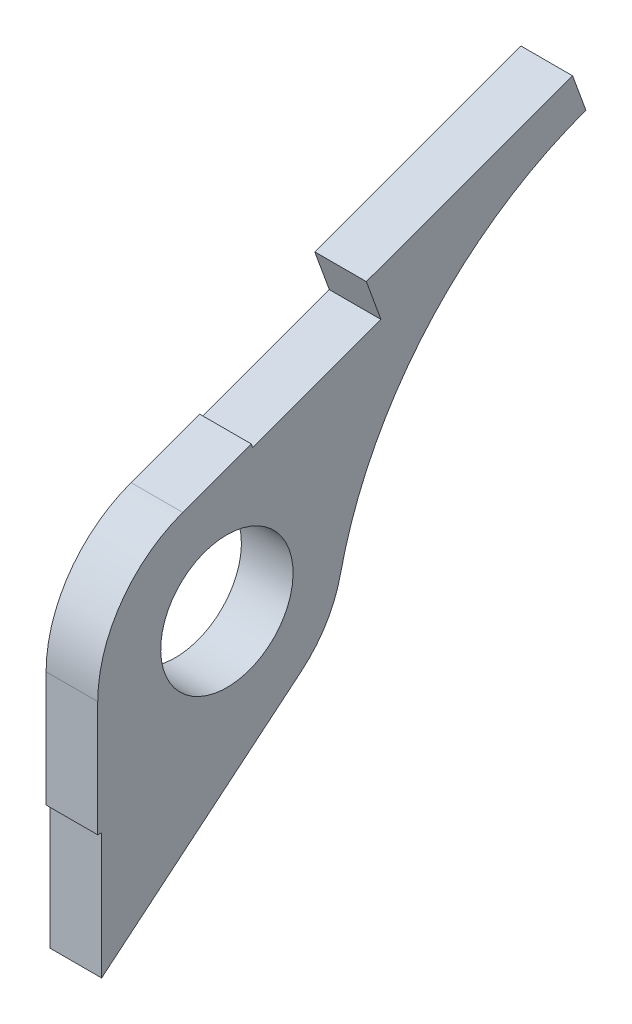
ISO-10303-21;
HEADER;
FILE_DESCRIPTION(('STEP AP214'),'2;1');
FILE_NAME('part.step','',(''),(''),'','','');
FILE_SCHEMA(('AUTOMOTIVE_DESIGN { 1 0 10303 214 1 1 1 1 }'));
ENDSEC;
DATA;
#1=APPLICATION_CONTEXT('core data for automotive mechanical design processes');
#2=APPLICATION_PROTOCOL_DEFINITION('international standard','automotive_design',2000,#1);
#3=PRODUCT_CONTEXT('',#1,'mechanical');
#4=PRODUCT('Part','Part','',(#3));
#5=PRODUCT_RELATED_PRODUCT_CATEGORY('part','',(#4));
#6=PRODUCT_DEFINITION_FORMATION('','',#4);
#7=PRODUCT_DEFINITION_CONTEXT('part definition',#1,'design');
#8=PRODUCT_DEFINITION('design','',#6,#7);
#9=PRODUCT_DEFINITION_SHAPE('','',#8);
#10=(LENGTH_UNIT() NAMED_UNIT(*) SI_UNIT(.MILLI.,.METRE.));
#11=(NAMED_UNIT(*) PLANE_ANGLE_UNIT() SI_UNIT($,.RADIAN.));
#12=(NAMED_UNIT(*) SI_UNIT($,.STERADIAN.) SOLID_ANGLE_UNIT());
#13=UNCERTAINTY_MEASURE_WITH_UNIT(LENGTH_MEASURE(1.E-05),#10,'distance_accuracy_value','');
#14=(GEOMETRIC_REPRESENTATION_CONTEXT(3) GLOBAL_UNCERTAINTY_ASSIGNED_CONTEXT((#13)) GLOBAL_UNIT_ASSIGNED_CONTEXT((#10,
#11,#12)) REPRESENTATION_CONTEXT('',''));
#15=CARTESIAN_POINT('',(0.,0.,0.));
#16=DIRECTION('',(0.,0.,1.));
#17=DIRECTION('',(1.,0.,0.));
#18=AXIS2_PLACEMENT_3D('',#15,#16,#17);
#19=CARTESIAN_POINT('',(195.308851424871,106.448198171886,262.091802222187));
#20=DIRECTION('',(0.,0.342020143325663,-0.93969262078591));
#21=DIRECTION('',(0.,0.939692620785911,0.342020143325663));
#22=AXIS2_PLACEMENT_3D('',#19,#20,#21);
#23=PLANE('',#22);
#24=DIRECTION('',(0.,0.93969262078591,0.342020143325663));
#25=VECTOR('',#24,1.);
#26=CARTESIAN_POINT('',(191.308851424871,106.448198171886,262.091802222187));
#27=LINE('',#26,#25);
#28=CARTESIAN_POINT('',(191.308851424871,106.730105958122,262.194408265185));
#29=VERTEX_POINT('',#28);
#30=CARTESIAN_POINT('',(191.308851424871,109.549183820479,263.220468695162));
#31=VERTEX_POINT('',#30);
#32=EDGE_CURVE('E162',#29,#31,#27,.T.);
#33=ORIENTED_EDGE('',*,*,#32,.T.);
#34=DIRECTION('',(-1.,0.,0.));
#35=VECTOR('',#34,1.);
#36=CARTESIAN_POINT('',(195.308851424871,109.549183820479,263.220468695162));
#37=LINE('',#36,#35);
#38=CARTESIAN_POINT('',(195.308851424871,109.549183820479,263.220468695162));
#39=VERTEX_POINT('',#38);
#40=EDGE_CURVE('E54',#39,#31,#37,.T.);
#41=ORIENTED_EDGE('',*,*,#40,.F.);
#42=DIRECTION('',(0.,0.93969262078591,0.342020143325663));
#43=VECTOR('',#42,1.);
#44=CARTESIAN_POINT('',(195.308851424871,106.448198171886,262.091802222187));
#45=LINE('',#44,#43);
#46=CARTESIAN_POINT('',(195.308851424871,106.730105958122,262.194408265185));
#47=VERTEX_POINT('',#46);
#48=EDGE_CURVE('E182',#47,#39,#45,.T.);
#49=ORIENTED_EDGE('',*,*,#48,.F.);
#50=DIRECTION('',(1.,0.,0.));
#51=VECTOR('',#50,1.);
#52=CARTESIAN_POINT('',(191.308851424871,106.730105958122,262.194408265185));
#53=LINE('',#52,#51);
#54=EDGE_CURVE('E195',#29,#47,#53,.T.);
#55=ORIENTED_EDGE('',*,*,#54,.F.);
#56=EDGE_LOOP('',(#33,#41,#49,#55));
#57=FACE_BOUND('',#56,.T.);
#58=ADVANCED_FACE('F37',(#57),#23,.T.);
#59=CARTESIAN_POINT('',(195.308851424871,100.63385573535,278.066576775547));
#60=DIRECTION('',(0.,-0.342020143325663,0.93969262078591));
#61=DIRECTION('',(0.,-0.939692620785911,-0.342020143325663));
#62=AXIS2_PLACEMENT_3D('',#59,#60,#61);
#63=PLANE('',#62);
#64=DIRECTION('',(0.,0.93969262078591,0.342020143325663));
#65=VECTOR('',#64,1.);
#66=CARTESIAN_POINT('',(195.308851424871,100.63385573535,278.066576775547));
#67=LINE('',#66,#65);
#68=CARTESIAN_POINT('',(195.308851424871,100.63385573535,278.066576775547));
#69=VERTEX_POINT('',#68);
#70=CARTESIAN_POINT('',(195.308851424871,103.734841383943,279.195243248522));
#71=VERTEX_POINT('',#70);
#72=EDGE_CURVE('E148',#69,#71,#67,.T.);
#73=ORIENTED_EDGE('',*,*,#72,.T.);
#74=DIRECTION('',(1.,0.,0.));
#75=VECTOR('',#74,1.);
#76=CARTESIAN_POINT('',(191.308851424871,103.734841383943,279.195243248522));
#77=LINE('',#76,#75);
#78=CARTESIAN_POINT('',(191.308851424871,103.734841383943,279.195243248522));
#79=VERTEX_POINT('',#78);
#80=EDGE_CURVE('E134',#79,#71,#77,.T.);
#81=ORIENTED_EDGE('',*,*,#80,.F.);
#82=DIRECTION('',(0.,0.93969262078591,0.342020143325663));
#83=VECTOR('',#82,1.);
#84=CARTESIAN_POINT('',(191.308851424871,100.63385573535,278.066576775547));
#85=LINE('',#84,#83);
#86=CARTESIAN_POINT('',(191.308851424871,100.63385573535,278.066576775547));
#87=VERTEX_POINT('',#86);
#88=EDGE_CURVE('E146',#87,#79,#85,.T.);
#89=ORIENTED_EDGE('',*,*,#88,.F.);
#90=DIRECTION('',(1.,0.,0.));
#91=VECTOR('',#90,1.);
#92=CARTESIAN_POINT('',(195.308851424871,100.63385573535,278.066576775547));
#93=LINE('',#92,#91);
#94=EDGE_CURVE('E166',#87,#69,#93,.T.);
#95=ORIENTED_EDGE('',*,*,#94,.T.);
#96=EDGE_LOOP('',(#73,#81,#89,#95));
#97=FACE_BOUND('',#96,.T.);
#98=ADVANCED_FACE('F144',(#97),#63,.T.);
#99=CARTESIAN_POINT('',(195.308851424871,78.5393273345444,251.933803965415));
#100=DIRECTION('',(-1.,0.,0.));
#101=DIRECTION('',(0.,-1.,0.));
#102=AXIS2_PLACEMENT_3D('',#99,#100,#101);
#103=PLANE('',#102);
#104=CARTESIAN_POINT('',(195.308851424871,87.0329435138107,289.997677706789));
#105=DIRECTION('',(1.,0.,0.));
#106=DIRECTION('',(0.,1.,0.));
#107=AXIS2_PLACEMENT_3D('',#104,#105,#106);
#108=CIRCLE('',#107,5.125);
#109=CARTESIAN_POINT('',(195.308851424871,92.1579435138107,289.997677706789));
#110=VERTEX_POINT('',#109);
#111=EDGE_CURVE('E168',#110,#110,#108,.T.);
#112=ORIENTED_EDGE('',*,*,#111,.F.);
#113=EDGE_LOOP('',(#112));
#114=FACE_BOUND('',#113,.T.);
#115=DIRECTION('',(0.,0.342020143325663,-0.93969262078591));
#116=VECTOR('',#115,1.);
#117=CARTESIAN_POINT('',(195.308851424871,103.734841383943,279.195243248522));
#118=LINE('',#117,#116);
#119=EDGE_CURVE('E149',#71,#39,#118,.T.);
#120=ORIENTED_EDGE('',*,*,#119,.F.);
#121=ORIENTED_EDGE('',*,*,#72,.F.);
#122=DIRECTION('',(0.,0.342020143325663,-0.939692620785911));
#123=VECTOR('',#122,1.);
#124=CARTESIAN_POINT('',(195.308851424871,106.448198171886,262.091802222187));
#125=LINE('',#124,#123);
#126=CARTESIAN_POINT('',(195.308851424871,97.0186352651759,287.9993133837));
#127=VERTEX_POINT('',#126);
#128=EDGE_CURVE('E165',#127,#69,#125,.T.);
#129=ORIENTED_EDGE('',*,*,#128,.F.);
#130=DIRECTION('',(0.,-0.939692620785911,-0.342020143325663));
#131=VECTOR('',#130,1.);
#132=CARTESIAN_POINT('',(195.308851424871,69.1097644278345,277.841315126928));
#133=LINE('',#132,#131);
#134=CARTESIAN_POINT('',(195.308851424871,97.3005430514117,288.101919426697));
#135=VERTEX_POINT('',#134);
#136=EDGE_CURVE('E46',#135,#127,#133,.T.);
#137=ORIENTED_EDGE('',*,*,#136,.F.);
#138=DIRECTION('',(0.,-0.342020143325663,0.93969262078591));
#139=VECTOR('',#138,1.);
#140=CARTESIAN_POINT('',(195.308851424871,95.3656919491948,293.417879140046));
#141=LINE('',#140,#139);
#142=CARTESIAN_POINT('',(195.308851424871,95.3656919491944,293.417879140046));
#143=VERTEX_POINT('',#142);
#144=EDGE_CURVE('E41',#135,#143,#141,.T.);
#145=ORIENTED_EDGE('',*,*,#144,.T.);
#146=CARTESIAN_POINT('',(195.308851424871,85.9687657413348,289.997677706789));
#147=DIRECTION('',(1.,0.,0.));
#148=DIRECTION('',(0.,1.,0.));
#149=AXIS2_PLACEMENT_3D('',#146,#147,#148);
#150=CIRCLE('',#149,10.0000000000004);
#151=CARTESIAN_POINT('',(195.308851424871,85.9687657413357,299.997677706789));
#152=VERTEX_POINT('',#151);
#153=EDGE_CURVE('E218',#143,#152,#150,.T.);
#154=ORIENTED_EDGE('',*,*,#153,.T.);
#155=DIRECTION('',(0.,-1.,0.));
#156=VECTOR('',#155,1.);
#157=CARTESIAN_POINT('',(195.308851424871,67.0329435138107,299.997677706789));
#158=LINE('',#157,#156);
#159=CARTESIAN_POINT('',(195.308851424871,77.0329435138107,299.997677706789));
#160=VERTEX_POINT('',#159);
#161=EDGE_CURVE('E215',#152,#160,#158,.T.);
#162=ORIENTED_EDGE('',*,*,#161,.T.);
#163=DIRECTION('',(0.,0.,-1.));
#164=VECTOR('',#163,1.);
#165=CARTESIAN_POINT('',(195.308851424871,77.0329435138107,251.933803965415));
#166=LINE('',#165,#164);
#167=CARTESIAN_POINT('',(195.308851424871,77.0329435138107,299.697677706789));
#168=VERTEX_POINT('',#167);
#169=EDGE_CURVE('E214',#160,#168,#166,.T.);
#170=ORIENTED_EDGE('',*,*,#169,.T.);
#171=DIRECTION('',(0.,1.,0.));
#172=VECTOR('',#171,1.);
#173=CARTESIAN_POINT('',(195.308851424871,78.5393273345444,299.697677706789));
#174=LINE('',#173,#172);
#175=CARTESIAN_POINT('',(195.308851424871,67.2820160599038,299.697677706789));
#176=VERTEX_POINT('',#175);
#177=EDGE_CURVE('E176',#176,#168,#174,.T.);
#178=ORIENTED_EDGE('',*,*,#177,.F.);
#179=DIRECTION('',(0.,0.638779579618374,-0.769389789809154));
#180=VECTOR('',#179,1.);
#181=CARTESIAN_POINT('',(195.308851424871,67.0329435138107,299.997677706789));
#182=LINE('',#181,#180);
#183=CARTESIAN_POINT('',(195.308851424871,80.1084354055289,284.248661490224));
#184=VERTEX_POINT('',#183);
#185=EDGE_CURVE('E212',#176,#184,#182,.T.);
#186=ORIENTED_EDGE('',*,*,#185,.T.);
#187=CARTESIAN_POINT('',(195.308851424871,87.0329435138107,289.997677706789));
#188=DIRECTION('',(1.,0.,0.));
#189=DIRECTION('',(0.,-1.,0.));
#190=AXIS2_PLACEMENT_3D('',#187,#188,#189);
#191=CIRCLE('',#190,8.99999999999954);
#192=CARTESIAN_POINT('',(195.308851424871,85.0728782416731,281.213706843395));
#193=VERTEX_POINT('',#192);
#194=EDGE_CURVE('E192',#184,#193,#191,.T.);
#195=ORIENTED_EDGE('',*,*,#194,.T.);
#196=CARTESIAN_POINT('',(195.308851424871,78.5393273345444,251.933803965415));
#197=DIRECTION('',(-1.,0.,0.));
#198=DIRECTION('',(0.,-1.,0.));
#199=AXIS2_PLACEMENT_3D('',#196,#197,#198);
#200=CIRCLE('',#199,30.);
#201=EDGE_CURVE('E189',#193,#47,#200,.T.);
#202=ORIENTED_EDGE('',*,*,#201,.T.);
#203=ORIENTED_EDGE('',*,*,#48,.T.);
#204=EDGE_LOOP('',(#120,#121,#129,#137,#145,#154,#162,#170,#178,#186,#195,#202,#203));
#205=FACE_BOUND('',#204,.T.);
#206=ADVANCED_FACE('F276',(#114,#205),#103,.F.);
#207=CARTESIAN_POINT('',(191.308851424871,78.5393273345444,251.933803965415));
#208=DIRECTION('',(-1.,0.,0.));
#209=DIRECTION('',(0.,-1.,0.));
#210=AXIS2_PLACEMENT_3D('',#207,#208,#209);
#211=PLANE('',#210);
#212=CARTESIAN_POINT('',(191.308851424871,87.0329435138107,289.997677706789));
#213=DIRECTION('',(1.,0.,0.));
#214=DIRECTION('',(0.,1.,0.));
#215=AXIS2_PLACEMENT_3D('',#212,#213,#214);
#216=CIRCLE('',#215,5.125);
#217=CARTESIAN_POINT('',(191.308851424871,92.1579435138107,289.997677706789));
#218=VERTEX_POINT('',#217);
#219=EDGE_CURVE('E170',#218,#218,#216,.T.);
#220=ORIENTED_EDGE('',*,*,#219,.T.);
#221=EDGE_LOOP('',(#220));
#222=FACE_BOUND('',#221,.T.);
#223=ORIENTED_EDGE('',*,*,#88,.T.);
#224=DIRECTION('',(0.,-0.342020143325663,0.939692620785911));
#225=VECTOR('',#224,1.);
#226=CARTESIAN_POINT('',(191.308851424871,109.549183820479,263.220468695162));
#227=LINE('',#226,#225);
#228=EDGE_CURVE('E131',#31,#79,#227,.T.);
#229=ORIENTED_EDGE('',*,*,#228,.F.);
#230=ORIENTED_EDGE('',*,*,#32,.F.);
#231=CARTESIAN_POINT('',(191.308851424871,78.5393273345444,251.933803965415));
#232=DIRECTION('',(-1.,0.,0.));
#233=DIRECTION('',(0.,-1.,0.));
#234=AXIS2_PLACEMENT_3D('',#231,#232,#233);
#235=CIRCLE('',#234,30.);
#236=CARTESIAN_POINT('',(191.308851424871,85.0728782416731,281.213706843395));
#237=VERTEX_POINT('',#236);
#238=EDGE_CURVE('E198',#237,#29,#235,.T.);
#239=ORIENTED_EDGE('',*,*,#238,.F.);
#240=CARTESIAN_POINT('',(191.308851424871,87.0329435138107,289.997677706789));
#241=DIRECTION('',(1.,0.,0.));
#242=DIRECTION('',(0.,-1.,0.));
#243=AXIS2_PLACEMENT_3D('',#240,#241,#242);
#244=CIRCLE('',#243,8.99999999999954);
#245=CARTESIAN_POINT('',(191.308851424871,80.1084354055289,284.248661490224));
#246=VERTEX_POINT('',#245);
#247=EDGE_CURVE('E197',#246,#237,#244,.T.);
#248=ORIENTED_EDGE('',*,*,#247,.F.);
#249=DIRECTION('',(0.,0.638779579618374,-0.769389789809154));
#250=VECTOR('',#249,1.);
#251=CARTESIAN_POINT('',(191.308851424871,67.0329435138107,299.997677706789));
#252=LINE('',#251,#250);
#253=CARTESIAN_POINT('',(191.308851424871,67.2820160599038,299.697677706789));
#254=VERTEX_POINT('',#253);
#255=EDGE_CURVE('E206',#254,#246,#252,.T.);
#256=ORIENTED_EDGE('',*,*,#255,.F.);
#257=DIRECTION('',(0.,-1.,0.));
#258=VECTOR('',#257,1.);
#259=CARTESIAN_POINT('',(191.308851424871,77.0329435138107,299.697677706789));
#260=LINE('',#259,#258);
#261=CARTESIAN_POINT('',(191.308851424871,77.0329435138107,299.697677706789));
#262=VERTEX_POINT('',#261);
#263=EDGE_CURVE('E175',#262,#254,#260,.T.);
#264=ORIENTED_EDGE('',*,*,#263,.F.);
#265=DIRECTION('',(0.,0.,1.));
#266=VECTOR('',#265,1.);
#267=CARTESIAN_POINT('',(191.308851424871,77.0329435138107,299.697677706789));
#268=LINE('',#267,#266);
#269=CARTESIAN_POINT('',(191.308851424871,77.0329435138107,299.997677706789));
#270=VERTEX_POINT('',#269);
#271=EDGE_CURVE('E154',#262,#270,#268,.T.);
#272=ORIENTED_EDGE('',*,*,#271,.T.);
#273=DIRECTION('',(0.,-1.,0.));
#274=VECTOR('',#273,1.);
#275=CARTESIAN_POINT('',(191.308851424871,67.0329435138107,299.997677706789));
#276=LINE('',#275,#274);
#277=CARTESIAN_POINT('',(191.308851424871,85.9687657413357,299.997677706789));
#278=VERTEX_POINT('',#277);
#279=EDGE_CURVE('E179',#278,#270,#276,.T.);
#280=ORIENTED_EDGE('',*,*,#279,.F.);
#281=CARTESIAN_POINT('',(191.308851424871,85.9687657413349,289.997677706789));
#282=DIRECTION('',(1.,0.,0.));
#283=DIRECTION('',(0.,1.,0.));
#284=AXIS2_PLACEMENT_3D('',#281,#282,#283);
#285=CIRCLE('',#284,10.0000000000004);
#286=CARTESIAN_POINT('',(191.308851424871,95.3656919491944,293.417879140046));
#287=VERTEX_POINT('',#286);
#288=EDGE_CURVE('E202',#287,#278,#285,.T.);
#289=ORIENTED_EDGE('',*,*,#288,.F.);
#290=DIRECTION('',(0.,-0.342020143325663,0.93969262078591));
#291=VECTOR('',#290,1.);
#292=CARTESIAN_POINT('',(191.308851424871,95.3656919491948,293.417879140046));
#293=LINE('',#292,#291);
#294=CARTESIAN_POINT('',(191.308851424871,97.3005430514117,288.101919426697));
#295=VERTEX_POINT('',#294);
#296=EDGE_CURVE('E180',#295,#287,#293,.T.);
#297=ORIENTED_EDGE('',*,*,#296,.F.);
#298=DIRECTION('',(0.,-0.939692620785911,-0.342020143325663));
#299=VECTOR('',#298,1.);
#300=CARTESIAN_POINT('',(191.308851424871,69.1097644278345,277.841315126928));
#301=LINE('',#300,#299);
#302=CARTESIAN_POINT('',(191.308851424871,97.0186352651759,287.9993133837));
#303=VERTEX_POINT('',#302);
#304=EDGE_CURVE('E61',#295,#303,#301,.T.);
#305=ORIENTED_EDGE('',*,*,#304,.T.);
#306=DIRECTION('',(0.,0.342020143325663,-0.939692620785911));
#307=VECTOR('',#306,1.);
#308=CARTESIAN_POINT('',(191.308851424871,106.448198171886,262.091802222187));
#309=LINE('',#308,#307);
#310=EDGE_CURVE('E153',#303,#87,#309,.T.);
#311=ORIENTED_EDGE('',*,*,#310,.T.);
#312=EDGE_LOOP('',(#223,#229,#230,#239,#248,#256,#264,#272,#280,#289,#297,#305,#311));
#313=FACE_BOUND('',#312,.T.);
#314=ADVANCED_FACE('F152',(#222,#313),#211,.T.);
#315=CARTESIAN_POINT('',(191.308851424871,78.5393273345444,251.933803965415));
#316=DIRECTION('',(1.,0.,0.));
#317=DIRECTION('',(0.,1.,0.));
#318=AXIS2_PLACEMENT_3D('',#315,#316,#317);
#319=CYLINDRICAL_SURFACE('',#318,30.);
#320=ORIENTED_EDGE('',*,*,#201,.F.);
#321=DIRECTION('',(1.,0.,0.));
#322=VECTOR('',#321,1.);
#323=CARTESIAN_POINT('',(191.308851424871,85.0728782416731,281.213706843395));
#324=LINE('',#323,#322);
#325=EDGE_CURVE('E207',#237,#193,#324,.T.);
#326=ORIENTED_EDGE('',*,*,#325,.F.);
#327=ORIENTED_EDGE('',*,*,#238,.T.);
#328=ORIENTED_EDGE('',*,*,#54,.T.);
#329=EDGE_LOOP('',(#320,#326,#327,#328));
#330=FACE_BOUND('',#329,.T.);
#331=ADVANCED_FACE('F307',(#330),#319,.F.);
#332=CARTESIAN_POINT('',(191.308851424871,87.0329435138107,289.997677706789));
#333=DIRECTION('',(1.,0.,0.));
#334=DIRECTION('',(0.,1.,0.));
#335=AXIS2_PLACEMENT_3D('',#332,#333,#334);
#336=CYLINDRICAL_SURFACE('',#335,8.99999999999954);
#337=ORIENTED_EDGE('',*,*,#194,.F.);
#338=DIRECTION('',(1.,0.,0.));
#339=VECTOR('',#338,1.);
#340=CARTESIAN_POINT('',(191.308851424871,80.1084354055289,284.248661490224));
#341=LINE('',#340,#339);
#342=EDGE_CURVE('E203',#246,#184,#341,.T.);
#343=ORIENTED_EDGE('',*,*,#342,.F.);
#344=ORIENTED_EDGE('',*,*,#247,.T.);
#345=ORIENTED_EDGE('',*,*,#325,.T.);
#346=EDGE_LOOP('',(#337,#343,#344,#345));
#347=FACE_BOUND('',#346,.T.);
#348=ADVANCED_FACE('F251',(#347),#336,.T.);
#349=CARTESIAN_POINT('',(191.308851424871,67.0329435138107,299.997677706789));
#350=DIRECTION('',(0.,-0.769389789809154,-0.638779579618374));
#351=DIRECTION('',(0.,0.638779579618374,-0.769389789809154));
#352=AXIS2_PLACEMENT_3D('',#349,#350,#351);
#353=PLANE('',#352);
#354=ORIENTED_EDGE('',*,*,#185,.F.);
#355=DIRECTION('',(-1.,0.,0.));
#356=VECTOR('',#355,1.);
#357=CARTESIAN_POINT('',(191.308851424871,67.2820160599038,299.697677706789));
#358=LINE('',#357,#356);
#359=EDGE_CURVE('E209',#176,#254,#358,.T.);
#360=ORIENTED_EDGE('',*,*,#359,.T.);
#361=ORIENTED_EDGE('',*,*,#255,.T.);
#362=ORIENTED_EDGE('',*,*,#342,.T.);
#363=EDGE_LOOP('',(#354,#360,#361,#362));
#364=FACE_BOUND('',#363,.T.);
#365=ADVANCED_FACE('F255',(#364),#353,.T.);
#366=CARTESIAN_POINT('',(0.,0.,299.697677706789));
#367=DIRECTION('',(0.,0.,1.));
#368=DIRECTION('',(1.,0.,0.));
#369=AXIS2_PLACEMENT_3D('',#366,#367,#368);
#370=PLANE('',#369);
#371=ORIENTED_EDGE('',*,*,#177,.T.);
#372=DIRECTION('',(-1.,0.,0.));
#373=VECTOR('',#372,1.);
#374=CARTESIAN_POINT('',(239.308851424871,77.0329435138107,299.697677706789));
#375=LINE('',#374,#373);
#376=EDGE_CURVE('E173',#168,#262,#375,.T.);
#377=ORIENTED_EDGE('',*,*,#376,.T.);
#378=ORIENTED_EDGE('',*,*,#263,.T.);
#379=ORIENTED_EDGE('',*,*,#359,.F.);
#380=EDGE_LOOP('',(#371,#377,#378,#379));
#381=FACE_BOUND('',#380,.T.);
#382=ADVANCED_FACE('F260',(#381),#370,.T.);
#383=CARTESIAN_POINT('',(239.308851424871,77.0329435138107,299.697677706789));
#384=DIRECTION('',(0.,1.,0.));
#385=DIRECTION('',(0.,0.,1.));
#386=AXIS2_PLACEMENT_3D('',#383,#384,#385);
#387=PLANE('',#386);
#388=DIRECTION('',(-1.,0.,0.));
#389=VECTOR('',#388,1.);
#390=CARTESIAN_POINT('',(191.308851424871,77.0329435138107,299.997677706789));
#391=LINE('',#390,#389);
#392=EDGE_CURVE('E177',#160,#270,#391,.T.);
#393=ORIENTED_EDGE('',*,*,#392,.T.);
#394=ORIENTED_EDGE('',*,*,#271,.F.);
#395=ORIENTED_EDGE('',*,*,#376,.F.);
#396=ORIENTED_EDGE('',*,*,#169,.F.);
#397=EDGE_LOOP('',(#393,#394,#395,#396));
#398=FACE_BOUND('',#397,.T.);
#399=ADVANCED_FACE('F264',(#398),#387,.F.);
#400=CARTESIAN_POINT('',(191.308851424871,67.0329435138107,299.997677706789));
#401=DIRECTION('',(0.,0.,1.));
#402=DIRECTION('',(1.,0.,0.));
#403=AXIS2_PLACEMENT_3D('',#400,#401,#402);
#404=PLANE('',#403);
#405=ORIENTED_EDGE('',*,*,#279,.T.);
#406=ORIENTED_EDGE('',*,*,#392,.F.);
#407=ORIENTED_EDGE('',*,*,#161,.F.);
#408=DIRECTION('',(1.,0.,0.));
#409=VECTOR('',#408,1.);
#410=CARTESIAN_POINT('',(191.308851424871,85.9687657413357,299.997677706789));
#411=LINE('',#410,#409);
#412=EDGE_CURVE('E200',#278,#152,#411,.T.);
#413=ORIENTED_EDGE('',*,*,#412,.F.);
#414=EDGE_LOOP('',(#405,#406,#407,#413));
#415=FACE_BOUND('',#414,.T.);
#416=ADVANCED_FACE('F268',(#415),#404,.T.);
#417=CARTESIAN_POINT('',(191.308851424871,85.9687657413349,289.997677706789));
#418=DIRECTION('',(1.,0.,0.));
#419=DIRECTION('',(0.,1.,0.));
#420=AXIS2_PLACEMENT_3D('',#417,#418,#419);
#421=CYLINDRICAL_SURFACE('',#420,10.0000000000004);
#422=ORIENTED_EDGE('',*,*,#153,.F.);
#423=DIRECTION('',(1.,0.,0.));
#424=VECTOR('',#423,1.);
#425=CARTESIAN_POINT('',(191.308851424871,95.3656919491944,293.417879140046));
#426=LINE('',#425,#424);
#427=EDGE_CURVE('E181',#287,#143,#426,.T.);
#428=ORIENTED_EDGE('',*,*,#427,.F.);
#429=ORIENTED_EDGE('',*,*,#288,.T.);
#430=ORIENTED_EDGE('',*,*,#412,.T.);
#431=EDGE_LOOP('',(#422,#428,#429,#430));
#432=FACE_BOUND('',#431,.T.);
#433=ADVANCED_FACE('F272',(#432),#421,.T.);
#434=CARTESIAN_POINT('',(191.308851424871,87.0329435138107,289.997677706789));
#435=DIRECTION('',(1.,0.,0.));
#436=DIRECTION('',(0.,1.,0.));
#437=AXIS2_PLACEMENT_3D('',#434,#435,#436);
#438=CYLINDRICAL_SURFACE('',#437,5.125);
#439=ORIENTED_EDGE('',*,*,#219,.F.);
#440=EDGE_LOOP('',(#439));
#441=FACE_BOUND('',#440,.T.);
#442=ORIENTED_EDGE('',*,*,#111,.T.);
#443=EDGE_LOOP('',(#442));
#444=FACE_BOUND('',#443,.T.);
#445=ADVANCED_FACE('F281',(#441,#444),#438,.F.);
#446=CARTESIAN_POINT('',(0.,178.230805965161,64.8707082005925));
#447=DIRECTION('',(0.,0.939692620785911,0.342020143325663));
#448=DIRECTION('',(0.,-0.342020143325663,0.939692620785911));
#449=AXIS2_PLACEMENT_3D('',#446,#447,#448);
#450=PLANE('',#449);
#451=ORIENTED_EDGE('',*,*,#310,.F.);
#452=DIRECTION('',(-1.,0.,0.));
#453=VECTOR('',#452,1.);
#454=CARTESIAN_POINT('',(241.508851424871,97.0186352651759,287.9993133837));
#455=LINE('',#454,#453);
#456=EDGE_CURVE('E11',#127,#303,#455,.T.);
#457=ORIENTED_EDGE('',*,*,#456,.F.);
#458=ORIENTED_EDGE('',*,*,#128,.T.);
#459=ORIENTED_EDGE('',*,*,#94,.F.);
#460=EDGE_LOOP('',(#451,#457,#458,#459));
#461=FACE_BOUND('',#460,.T.);
#462=ADVANCED_FACE('F279',(#461),#450,.T.);
#463=CARTESIAN_POINT('',(191.308851424871,95.3656919491948,293.417879140046));
#464=DIRECTION('',(0.,0.93969262078591,0.342020143325663));
#465=DIRECTION('',(0.,-0.342020143325663,0.93969262078591));
#466=AXIS2_PLACEMENT_3D('',#463,#464,#465);
#467=PLANE('',#466);
#468=ORIENTED_EDGE('',*,*,#144,.F.);
#469=DIRECTION('',(1.,0.,0.));
#470=VECTOR('',#469,1.);
#471=CARTESIAN_POINT('',(253.5,97.3005430514117,288.101919426697));
#472=LINE('',#471,#470);
#473=EDGE_CURVE('E157',#295,#135,#472,.T.);
#474=ORIENTED_EDGE('',*,*,#473,.F.);
#475=ORIENTED_EDGE('',*,*,#296,.T.);
#476=ORIENTED_EDGE('',*,*,#427,.T.);
#477=EDGE_LOOP('',(#468,#474,#475,#476));
#478=FACE_BOUND('',#477,.T.);
#479=ADVANCED_FACE('F274',(#478),#467,.T.);
#480=CARTESIAN_POINT('',(241.508851424871,97.0186352651759,287.9993133837));
#481=DIRECTION('',(0.,0.342020143325663,-0.93969262078591));
#482=DIRECTION('',(0.,0.939692620785911,0.342020143325663));
#483=AXIS2_PLACEMENT_3D('',#480,#481,#482);
#484=PLANE('',#483);
#485=ORIENTED_EDGE('',*,*,#473,.T.);
#486=ORIENTED_EDGE('',*,*,#136,.T.);
#487=ORIENTED_EDGE('',*,*,#456,.T.);
#488=ORIENTED_EDGE('',*,*,#304,.F.);
#489=EDGE_LOOP('',(#485,#486,#487,#488));
#490=FACE_BOUND('',#489,.T.);
#491=ADVANCED_FACE('F39',(#490),#484,.T.);
#492=CARTESIAN_POINT('',(0.,181.331791613754,65.9993746735671));
#493=DIRECTION('',(0.,0.939692620785911,0.342020143325663));
#494=DIRECTION('',(0.,-0.342020143325663,0.939692620785911));
#495=AXIS2_PLACEMENT_3D('',#492,#493,#494);
#496=PLANE('',#495);
#497=ORIENTED_EDGE('',*,*,#228,.T.);
#498=ORIENTED_EDGE('',*,*,#80,.T.);
#499=ORIENTED_EDGE('',*,*,#119,.T.);
#500=ORIENTED_EDGE('',*,*,#40,.T.);
#501=EDGE_LOOP('',(#497,#498,#499,#500));
#502=FACE_BOUND('',#501,.T.);
#503=ADVANCED_FACE('F133',(#502),#496,.T.);
#504=CLOSED_SHELL('',(#58,#98,#206,#314,#331,#348,#365,#382,#399,#416,#433,#445,#462,#479,#491,#503));
#505=MANIFOLD_SOLID_BREP('B2',#504);
#506=ADVANCED_BREP_SHAPE_REPRESENTATION('',(#18,#505),#14);
#507=SHAPE_DEFINITION_REPRESENTATION(#9,#506);
ENDSEC;
END-ISO-10303-21;
